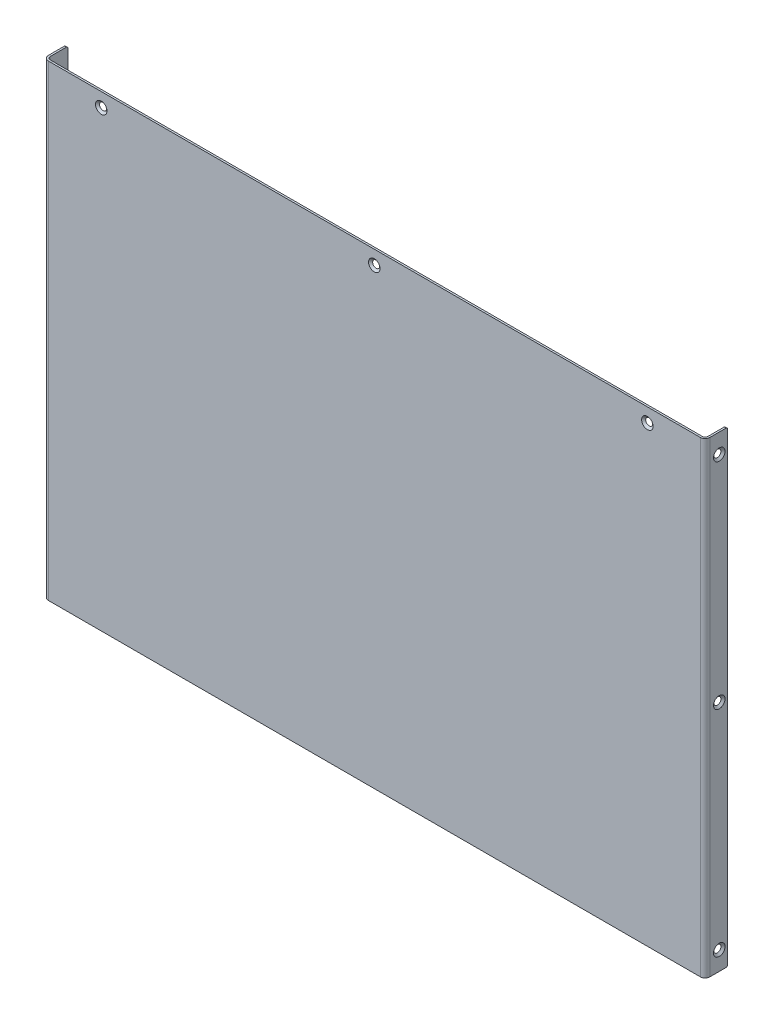
ISO-10303-21;
HEADER;
FILE_DESCRIPTION(('STEP AP214'),'2;1');
FILE_NAME('part.step','',(''),(''),'','','');
FILE_SCHEMA(('AUTOMOTIVE_DESIGN { 1 0 10303 214 1 1 1 1 }'));
ENDSEC;
DATA;
#1=APPLICATION_CONTEXT('core data for automotive mechanical design processes');
#2=APPLICATION_PROTOCOL_DEFINITION('international standard','automotive_design',2000,#1);
#3=PRODUCT_CONTEXT('',#1,'mechanical');
#4=PRODUCT('Part','Part','',(#3));
#5=PRODUCT_RELATED_PRODUCT_CATEGORY('part','',(#4));
#6=PRODUCT_DEFINITION_FORMATION('','',#4);
#7=PRODUCT_DEFINITION_CONTEXT('part definition',#1,'design');
#8=PRODUCT_DEFINITION('design','',#6,#7);
#9=PRODUCT_DEFINITION_SHAPE('','',#8);
#10=(LENGTH_UNIT() NAMED_UNIT(*) SI_UNIT(.MILLI.,.METRE.));
#11=(NAMED_UNIT(*) PLANE_ANGLE_UNIT() SI_UNIT($,.RADIAN.));
#12=(NAMED_UNIT(*) SI_UNIT($,.STERADIAN.) SOLID_ANGLE_UNIT());
#13=UNCERTAINTY_MEASURE_WITH_UNIT(LENGTH_MEASURE(1.E-05),#10,'distance_accuracy_value','');
#14=(GEOMETRIC_REPRESENTATION_CONTEXT(3) GLOBAL_UNCERTAINTY_ASSIGNED_CONTEXT((#13)) GLOBAL_UNIT_ASSIGNED_CONTEXT((#10,
#11,#12)) REPRESENTATION_CONTEXT('',''));
#15=CARTESIAN_POINT('',(0.,0.,0.));
#16=DIRECTION('',(0.,0.,1.));
#17=DIRECTION('',(1.,0.,0.));
#18=AXIS2_PLACEMENT_3D('',#15,#16,#17);
#19=CARTESIAN_POINT('',(-1.4732,152.654000000152,34.7834736718518));
#20=DIRECTION('',(1.,0.,0.));
#21=DIRECTION('',(0.,0.,-1.));
#22=AXIS2_PLACEMENT_3D('',#19,#20,#21);
#23=PLANE('',#22);
#24=CARTESIAN_POINT('',(-1.4732000000006,12.7,34.47415));
#25=DIRECTION('',(-1.,0.,0.));
#26=DIRECTION('',(0.,0.,1.));
#27=AXIS2_PLACEMENT_3D('',#24,#25,#26);
#28=CIRCLE('',#27,3.7464999999995);
#29=CARTESIAN_POINT('',(-1.4732000000006,12.7,38.2206499999995));
#30=VERTEX_POINT('',#29);
#31=EDGE_CURVE('E305',#30,#30,#28,.F.);
#32=ORIENTED_EDGE('',*,*,#31,.T.);
#33=EDGE_LOOP('',(#32));
#34=FACE_BOUND('',#33,.T.);
#35=CARTESIAN_POINT('',(-1.47320000000059,152.4,34.47415));
#36=DIRECTION('',(-1.,0.,0.));
#37=DIRECTION('',(0.,0.,1.));
#38=AXIS2_PLACEMENT_3D('',#35,#36,#37);
#39=CIRCLE('',#38,3.74649999999949);
#40=CARTESIAN_POINT('',(-1.47320000000059,152.4,38.2206499999995));
#41=VERTEX_POINT('',#40);
#42=EDGE_CURVE('E309',#41,#41,#39,.F.);
#43=ORIENTED_EDGE('',*,*,#42,.T.);
#44=EDGE_LOOP('',(#43));
#45=FACE_BOUND('',#44,.T.);
#46=CARTESIAN_POINT('',(-1.47320000000059,292.1,34.47415));
#47=DIRECTION('',(-1.,0.,0.));
#48=DIRECTION('',(0.,0.,1.));
#49=AXIS2_PLACEMENT_3D('',#46,#47,#48);
#50=CIRCLE('',#49,3.74649999999949);
#51=CARTESIAN_POINT('',(-1.47320000000059,292.1,38.2206499999995));
#52=VERTEX_POINT('',#51);
#53=EDGE_CURVE('E170',#52,#52,#50,.F.);
#54=ORIENTED_EDGE('',*,*,#53,.T.);
#55=EDGE_LOOP('',(#54));
#56=FACE_BOUND('',#55,.T.);
#57=CARTESIAN_POINT('',(-1.4732,303.53000000066,30.2513999993396));
#58=DIRECTION('',(-1.,0.,0.));
#59=DIRECTION('',(0.,0.,1.));
#60=AXIS2_PLACEMENT_3D('',#57,#58,#59);
#61=CIRCLE('',#60,1.2699999993523);
#62=CARTESIAN_POINT('',(-1.4732,303.53000000033,28.9813999999936));
#63=VERTEX_POINT('',#62);
#64=CARTESIAN_POINT('',(-1.4732,304.8,30.2513999996698));
#65=VERTEX_POINT('',#64);
#66=EDGE_CURVE('E142',#63,#65,#61,.F.);
#67=ORIENTED_EDGE('',*,*,#66,.F.);
#68=DIRECTION('',(0.,-1.,0.));
#69=VECTOR('',#68,1.);
#70=CARTESIAN_POINT('',(-1.4732,1.778,28.9814));
#71=LINE('',#70,#69);
#72=CARTESIAN_POINT('',(-1.4732,1.77799999967615,28.9814));
#73=VERTEX_POINT('',#72);
#74=EDGE_CURVE('E140',#63,#73,#71,.T.);
#75=ORIENTED_EDGE('',*,*,#74,.T.);
#76=CARTESIAN_POINT('',(-1.4732,1.7779999993523,30.251399999365));
#77=DIRECTION('',(-1.,0.,0.));
#78=DIRECTION('',(0.,0.,1.));
#79=AXIS2_PLACEMENT_3D('',#76,#77,#78);
#80=CIRCLE('',#79,1.2699999993523);
#81=CARTESIAN_POINT('',(-1.4732,0.507999999999998,30.2513999996825));
#82=VERTEX_POINT('',#81);
#83=EDGE_CURVE('E20',#82,#73,#80,.F.);
#84=ORIENTED_EDGE('',*,*,#83,.F.);
#85=DIRECTION('',(0.,0.,1.));
#86=VECTOR('',#85,1.);
#87=CARTESIAN_POINT('',(-1.4732,0.508,40.5638));
#88=LINE('',#87,#86);
#89=CARTESIAN_POINT('',(-1.47320000000001,0.508000000000004,40.5638000000001));
#90=VERTEX_POINT('',#89);
#91=EDGE_CURVE('E138',#82,#90,#88,.T.);
#92=ORIENTED_EDGE('',*,*,#91,.T.);
#93=DIRECTION('',(0.,-1.,0.));
#94=VECTOR('',#93,1.);
#95=CARTESIAN_POINT('',(-1.4732,304.8,40.5638));
#96=LINE('',#95,#94);
#97=CARTESIAN_POINT('',(-1.4732,304.8,40.5638));
#98=VERTEX_POINT('',#97);
#99=EDGE_CURVE('E178',#98,#90,#96,.T.);
#100=ORIENTED_EDGE('',*,*,#99,.F.);
#101=DIRECTION('',(0.,0.,-1.));
#102=VECTOR('',#101,1.);
#103=CARTESIAN_POINT('',(-1.4732,304.8,30.2514));
#104=LINE('',#103,#102);
#105=EDGE_CURVE('E167',#98,#65,#104,.T.);
#106=ORIENTED_EDGE('',*,*,#105,.T.);
#107=EDGE_LOOP('',(#67,#75,#84,#92,#100,#106));
#108=FACE_BOUND('',#107,.T.);
#109=ADVANCED_FACE('F17',(#34,#45,#56,#108),#23,.F.);
#110=CARTESIAN_POINT('',(429.4632,152.653999999848,34.7834736718518));
#111=DIRECTION('',(-1.,0.,0.));
#112=DIRECTION('',(0.,-1.,0.));
#113=AXIS2_PLACEMENT_3D('',#110,#111,#112);
#114=PLANE('',#113);
#115=CARTESIAN_POINT('',(429.463199999995,12.7,34.47415));
#116=DIRECTION('',(1.,0.,0.));
#117=DIRECTION('',(0.,0.,-1.));
#118=AXIS2_PLACEMENT_3D('',#115,#116,#117);
#119=CIRCLE('',#118,3.74650000000387);
#120=CARTESIAN_POINT('',(429.463199999995,12.7,30.7276499999961));
#121=VERTEX_POINT('',#120);
#122=EDGE_CURVE('E183',#121,#121,#119,.F.);
#123=ORIENTED_EDGE('',*,*,#122,.T.);
#124=EDGE_LOOP('',(#123));
#125=FACE_BOUND('',#124,.T.);
#126=CARTESIAN_POINT('',(429.463199999995,292.1,34.47415));
#127=DIRECTION('',(1.,0.,0.));
#128=DIRECTION('',(0.,0.,-1.));
#129=AXIS2_PLACEMENT_3D('',#126,#127,#128);
#130=CIRCLE('',#129,3.74650000000393);
#131=CARTESIAN_POINT('',(429.463199999995,292.1,30.7276499999961));
#132=VERTEX_POINT('',#131);
#133=EDGE_CURVE('E288',#132,#132,#130,.F.);
#134=ORIENTED_EDGE('',*,*,#133,.T.);
#135=EDGE_LOOP('',(#134));
#136=FACE_BOUND('',#135,.T.);
#137=CARTESIAN_POINT('',(429.463199999995,152.4,34.47415));
#138=DIRECTION('',(1.,0.,0.));
#139=DIRECTION('',(0.,0.,-1.));
#140=AXIS2_PLACEMENT_3D('',#137,#138,#139);
#141=CIRCLE('',#140,3.74650000000387);
#142=CARTESIAN_POINT('',(429.463199999995,152.4,30.7276499999961));
#143=VERTEX_POINT('',#142);
#144=EDGE_CURVE('E292',#143,#143,#141,.F.);
#145=ORIENTED_EDGE('',*,*,#144,.T.);
#146=EDGE_LOOP('',(#145));
#147=FACE_BOUND('',#146,.T.);
#148=CARTESIAN_POINT('',(429.4632,1.7779999993523,30.251399999365));
#149=DIRECTION('',(1.,0.,0.));
#150=DIRECTION('',(0.,1.,0.));
#151=AXIS2_PLACEMENT_3D('',#148,#149,#150);
#152=CIRCLE('',#151,1.2699999993523);
#153=CARTESIAN_POINT('',(429.4632,1.77799999967615,28.9814000000064));
#154=VERTEX_POINT('',#153);
#155=CARTESIAN_POINT('',(429.4632,0.508,30.2513999996825));
#156=VERTEX_POINT('',#155);
#157=EDGE_CURVE('E203',#154,#156,#152,.F.);
#158=ORIENTED_EDGE('',*,*,#157,.F.);
#159=DIRECTION('',(0.,-1.,0.));
#160=VECTOR('',#159,1.);
#161=CARTESIAN_POINT('',(429.4632,303.53,28.9814));
#162=LINE('',#161,#160);
#163=CARTESIAN_POINT('',(429.4632,303.53000000033,28.9814));
#164=VERTEX_POINT('',#163);
#165=EDGE_CURVE('E200',#154,#164,#162,.F.);
#166=ORIENTED_EDGE('',*,*,#165,.T.);
#167=CARTESIAN_POINT('',(429.4632,303.53000000066,30.2513999993396));
#168=DIRECTION('',(1.,0.,0.));
#169=DIRECTION('',(0.,1.,0.));
#170=AXIS2_PLACEMENT_3D('',#167,#168,#169);
#171=CIRCLE('',#170,1.2699999993523);
#172=CARTESIAN_POINT('',(429.4632,304.800000000006,30.2513999993396));
#173=VERTEX_POINT('',#172);
#174=EDGE_CURVE('E300',#173,#164,#171,.F.);
#175=ORIENTED_EDGE('',*,*,#174,.F.);
#176=DIRECTION('',(0.,0.,-1.));
#177=VECTOR('',#176,1.);
#178=CARTESIAN_POINT('',(429.4632,304.8,40.5638));
#179=LINE('',#178,#177);
#180=CARTESIAN_POINT('',(429.4632,304.8,40.5637999999999));
#181=VERTEX_POINT('',#180);
#182=EDGE_CURVE('E304',#173,#181,#179,.F.);
#183=ORIENTED_EDGE('',*,*,#182,.T.);
#184=DIRECTION('',(0.,1.,0.));
#185=VECTOR('',#184,1.);
#186=CARTESIAN_POINT('',(429.4632,0.507999999999999,40.5638));
#187=LINE('',#186,#185);
#188=CARTESIAN_POINT('',(429.4632,0.508000000000001,40.5638));
#189=VERTEX_POINT('',#188);
#190=EDGE_CURVE('E182',#189,#181,#187,.T.);
#191=ORIENTED_EDGE('',*,*,#190,.F.);
#192=DIRECTION('',(0.,0.,1.));
#193=VECTOR('',#192,1.);
#194=CARTESIAN_POINT('',(429.4632,0.508,30.2514));
#195=LINE('',#194,#193);
#196=EDGE_CURVE('E296',#189,#156,#195,.F.);
#197=ORIENTED_EDGE('',*,*,#196,.T.);
#198=EDGE_LOOP('',(#158,#166,#175,#183,#191,#197));
#199=FACE_BOUND('',#198,.T.);
#200=ADVANCED_FACE('F369',(#125,#136,#147,#199),#114,.F.);
#201=CARTESIAN_POINT('',(-1.4732,1.7779999993523,30.251399999365));
#202=DIRECTION('',(-1.,0.,0.));
#203=DIRECTION('',(0.,0.,1.));
#204=AXIS2_PLACEMENT_3D('',#201,#202,#203);
#205=CYLINDRICAL_SURFACE('',#204,1.2699999993523);
#206=CARTESIAN_POINT('',(-0.253999999999898,1.7779999993523,30.251399999365));
#207=DIRECTION('',(-1.,0.,0.));
#208=DIRECTION('',(0.,0.,1.));
#209=AXIS2_PLACEMENT_3D('',#206,#207,#208);
#210=CIRCLE('',#209,1.2699999993523);
#211=CARTESIAN_POINT('',(-0.253999999999903,0.508000000000006,30.2513999996825));
#212=VERTEX_POINT('',#211);
#213=CARTESIAN_POINT('',(-0.253999999999904,1.77799999967615,28.9814));
#214=VERTEX_POINT('',#213);
#215=EDGE_CURVE('E273',#212,#214,#210,.F.);
#216=ORIENTED_EDGE('',*,*,#215,.F.);
#217=DIRECTION('',(-1.,0.,0.));
#218=VECTOR('',#217,1.);
#219=CARTESIAN_POINT('',(-1.4732,0.508,30.2514));
#220=LINE('',#219,#218);
#221=EDGE_CURVE('E136',#212,#82,#220,.T.);
#222=ORIENTED_EDGE('',*,*,#221,.T.);
#223=ORIENTED_EDGE('',*,*,#83,.T.);
#224=DIRECTION('',(1.,0.,0.));
#225=VECTOR('',#224,1.);
#226=CARTESIAN_POINT('',(-1.4732,1.778,28.9814));
#227=LINE('',#226,#225);
#228=EDGE_CURVE('E134',#73,#214,#227,.T.);
#229=ORIENTED_EDGE('',*,*,#228,.T.);
#230=EDGE_LOOP('',(#216,#222,#223,#229));
#231=FACE_BOUND('',#230,.T.);
#232=ADVANCED_FACE('F132',(#231),#205,.T.);
#233=CARTESIAN_POINT('',(-1.4732,1.778,28.9814));
#234=DIRECTION('',(0.,0.,1.));
#235=DIRECTION('',(0.,-1.,0.));
#236=AXIS2_PLACEMENT_3D('',#233,#234,#235);
#237=PLANE('',#236);
#238=DIRECTION('',(-1.,0.,0.));
#239=VECTOR('',#238,1.);
#240=CARTESIAN_POINT('',(-1.4732,303.53,28.9813999999873));
#241=LINE('',#240,#239);
#242=CARTESIAN_POINT('',(-0.253999999999873,303.53000000033,28.9813999999936));
#243=VERTEX_POINT('',#242);
#244=EDGE_CURVE('E157',#243,#63,#241,.T.);
#245=ORIENTED_EDGE('',*,*,#244,.F.);
#246=DIRECTION('',(0.,1.,0.));
#247=VECTOR('',#246,1.);
#248=CARTESIAN_POINT('',(-0.253999999999899,152.654000000152,28.9814));
#249=LINE('',#248,#247);
#250=EDGE_CURVE('E149',#214,#243,#249,.T.);
#251=ORIENTED_EDGE('',*,*,#250,.F.);
#252=ORIENTED_EDGE('',*,*,#228,.F.);
#253=ORIENTED_EDGE('',*,*,#74,.F.);
#254=EDGE_LOOP('',(#245,#251,#252,#253));
#255=FACE_BOUND('',#254,.T.);
#256=ADVANCED_FACE('F147',(#255),#237,.F.);
#257=CARTESIAN_POINT('',(-1.4732,303.53000000066,30.2513999993396));
#258=DIRECTION('',(-1.,0.,0.));
#259=DIRECTION('',(0.,0.,1.));
#260=AXIS2_PLACEMENT_3D('',#257,#258,#259);
#261=CYLINDRICAL_SURFACE('',#260,1.2699999993523);
#262=CARTESIAN_POINT('',(-0.253999999999873,303.53000000066,30.2513999993396));
#263=DIRECTION('',(-1.,0.,0.));
#264=DIRECTION('',(0.,0.,1.));
#265=AXIS2_PLACEMENT_3D('',#262,#263,#264);
#266=CIRCLE('',#265,1.2699999993523);
#267=CARTESIAN_POINT('',(-0.253999999999881,304.8,30.2513999996698));
#268=VERTEX_POINT('',#267);
#269=EDGE_CURVE('E269',#243,#268,#266,.F.);
#270=ORIENTED_EDGE('',*,*,#269,.F.);
#271=ORIENTED_EDGE('',*,*,#244,.T.);
#272=ORIENTED_EDGE('',*,*,#66,.T.);
#273=DIRECTION('',(1.,0.,0.));
#274=VECTOR('',#273,1.);
#275=CARTESIAN_POINT('',(-1.4732,304.8,30.2514));
#276=LINE('',#275,#274);
#277=EDGE_CURVE('E171',#65,#268,#276,.T.);
#278=ORIENTED_EDGE('',*,*,#277,.T.);
#279=EDGE_LOOP('',(#270,#271,#272,#278));
#280=FACE_BOUND('',#279,.T.);
#281=ADVANCED_FACE('F644',(#280),#261,.T.);
#282=CARTESIAN_POINT('',(-1.47320000000059,292.1,34.47415));
#283=DIRECTION('',(-1.,0.,0.));
#284=DIRECTION('',(0.,0.,1.));
#285=AXIS2_PLACEMENT_3D('',#282,#283,#284);
#286=CONICAL_SURFACE('',#285,3.74649999999949,0.872664625996998);
#287=CARTESIAN_POINT('',(-0.253999999994314,292.1,34.47415));
#288=DIRECTION('',(-1.,0.,0.));
#289=DIRECTION('',(0.,0.,1.));
#290=AXIS2_PLACEMENT_3D('',#287,#288,#289);
#291=CIRCLE('',#290,2.29351401990163);
#292=CARTESIAN_POINT('',(-0.253999999994314,292.1,36.7676640199016));
#293=VERTEX_POINT('',#292);
#294=EDGE_CURVE('E264',#293,#293,#291,.T.);
#295=ORIENTED_EDGE('',*,*,#294,.F.);
#296=EDGE_LOOP('',(#295));
#297=FACE_BOUND('',#296,.T.);
#298=ORIENTED_EDGE('',*,*,#53,.F.);
#299=EDGE_LOOP('',(#298));
#300=FACE_BOUND('',#299,.T.);
#301=ADVANCED_FACE('F635',(#297,#300),#286,.F.);
#302=CARTESIAN_POINT('',(-1.47320000000059,152.4,34.47415));
#303=DIRECTION('',(-1.,0.,0.));
#304=DIRECTION('',(0.,0.,1.));
#305=AXIS2_PLACEMENT_3D('',#302,#303,#304);
#306=CONICAL_SURFACE('',#305,3.74649999999949,0.872664625997001);
#307=CARTESIAN_POINT('',(-0.253999999994314,152.4,34.47415));
#308=DIRECTION('',(-1.,0.,0.));
#309=DIRECTION('',(0.,0.,1.));
#310=AXIS2_PLACEMENT_3D('',#307,#308,#309);
#311=CIRCLE('',#310,2.29351401990163);
#312=CARTESIAN_POINT('',(-0.253999999994314,152.4,36.7676640199016));
#313=VERTEX_POINT('',#312);
#314=EDGE_CURVE('E260',#313,#313,#311,.T.);
#315=ORIENTED_EDGE('',*,*,#314,.F.);
#316=EDGE_LOOP('',(#315));
#317=FACE_BOUND('',#316,.T.);
#318=ORIENTED_EDGE('',*,*,#42,.F.);
#319=EDGE_LOOP('',(#318));
#320=FACE_BOUND('',#319,.T.);
#321=ADVANCED_FACE('F626',(#317,#320),#306,.F.);
#322=CARTESIAN_POINT('',(-1.4732000000006,12.7,34.47415));
#323=DIRECTION('',(-1.,0.,0.));
#324=DIRECTION('',(0.,0.,1.));
#325=AXIS2_PLACEMENT_3D('',#322,#323,#324);
#326=CONICAL_SURFACE('',#325,3.7464999999995,0.872664625997);
#327=CARTESIAN_POINT('',(-0.25399999999435,12.7,34.47415));
#328=DIRECTION('',(-1.,0.,0.));
#329=DIRECTION('',(0.,0.,1.));
#330=AXIS2_PLACEMENT_3D('',#327,#328,#329);
#331=CIRCLE('',#330,2.29351401990167);
#332=CARTESIAN_POINT('',(-0.253999999994349,12.7,36.7676640199017));
#333=VERTEX_POINT('',#332);
#334=EDGE_CURVE('E256',#333,#333,#331,.T.);
#335=ORIENTED_EDGE('',*,*,#334,.F.);
#336=EDGE_LOOP('',(#335));
#337=FACE_BOUND('',#336,.T.);
#338=ORIENTED_EDGE('',*,*,#31,.F.);
#339=EDGE_LOOP('',(#338));
#340=FACE_BOUND('',#339,.T.);
#341=ADVANCED_FACE('F618',(#337,#340),#326,.F.);
#342=CARTESIAN_POINT('',(429.4632,303.53000000066,30.2513999993396));
#343=DIRECTION('',(1.,0.,0.));
#344=DIRECTION('',(0.,1.,0.));
#345=AXIS2_PLACEMENT_3D('',#342,#343,#344);
#346=CYLINDRICAL_SURFACE('',#345,1.2699999993523);
#347=CARTESIAN_POINT('',(428.244,303.53000000066,30.2513999993396));
#348=DIRECTION('',(1.,0.,0.));
#349=DIRECTION('',(0.,1.,0.));
#350=AXIS2_PLACEMENT_3D('',#347,#348,#349);
#351=CIRCLE('',#350,1.2699999993523);
#352=CARTESIAN_POINT('',(428.244,304.800000000006,30.2513999993396));
#353=VERTEX_POINT('',#352);
#354=CARTESIAN_POINT('',(428.244,303.53000000033,28.9814));
#355=VERTEX_POINT('',#354);
#356=EDGE_CURVE('E243',#353,#355,#351,.F.);
#357=ORIENTED_EDGE('',*,*,#356,.F.);
#358=DIRECTION('',(1.,0.,0.));
#359=VECTOR('',#358,1.);
#360=CARTESIAN_POINT('',(429.4632,304.800000000013,30.2513999993396));
#361=LINE('',#360,#359);
#362=EDGE_CURVE('E303',#353,#173,#361,.T.);
#363=ORIENTED_EDGE('',*,*,#362,.T.);
#364=ORIENTED_EDGE('',*,*,#174,.T.);
#365=DIRECTION('',(1.,0.,0.));
#366=VECTOR('',#365,1.);
#367=CARTESIAN_POINT('',(429.4632,303.53,28.9814));
#368=LINE('',#367,#366);
#369=EDGE_CURVE('E204',#164,#355,#368,.F.);
#370=ORIENTED_EDGE('',*,*,#369,.T.);
#371=EDGE_LOOP('',(#357,#363,#364,#370));
#372=FACE_BOUND('',#371,.T.);
#373=ADVANCED_FACE('F407',(#372),#346,.T.);
#374=CARTESIAN_POINT('',(429.4632,303.53,28.9814));
#375=DIRECTION('',(0.,0.,1.));
#376=DIRECTION('',(0.,-1.,0.));
#377=AXIS2_PLACEMENT_3D('',#374,#375,#376);
#378=PLANE('',#377);
#379=DIRECTION('',(1.,0.,0.));
#380=VECTOR('',#379,1.);
#381=CARTESIAN_POINT('',(429.4632,1.778,28.9814000000127));
#382=LINE('',#381,#380);
#383=CARTESIAN_POINT('',(428.244,1.77799999967615,28.9814000000063));
#384=VERTEX_POINT('',#383);
#385=EDGE_CURVE('E299',#384,#154,#382,.T.);
#386=ORIENTED_EDGE('',*,*,#385,.F.);
#387=DIRECTION('',(0.,-1.,0.));
#388=VECTOR('',#387,1.);
#389=CARTESIAN_POINT('',(428.244,152.653999999848,28.9814));
#390=LINE('',#389,#388);
#391=EDGE_CURVE('E242',#355,#384,#390,.T.);
#392=ORIENTED_EDGE('',*,*,#391,.F.);
#393=ORIENTED_EDGE('',*,*,#369,.F.);
#394=ORIENTED_EDGE('',*,*,#165,.F.);
#395=EDGE_LOOP('',(#386,#392,#393,#394));
#396=FACE_BOUND('',#395,.T.);
#397=ADVANCED_FACE('F391',(#396),#378,.F.);
#398=CARTESIAN_POINT('',(429.4632,1.7779999993523,30.251399999365));
#399=DIRECTION('',(1.,0.,0.));
#400=DIRECTION('',(0.,1.,0.));
#401=AXIS2_PLACEMENT_3D('',#398,#399,#400);
#402=CYLINDRICAL_SURFACE('',#401,1.2699999993523);
#403=CARTESIAN_POINT('',(428.244,1.7779999993523,30.251399999365));
#404=DIRECTION('',(1.,0.,0.));
#405=DIRECTION('',(0.,1.,0.));
#406=AXIS2_PLACEMENT_3D('',#403,#404,#405);
#407=CIRCLE('',#406,1.2699999993523);
#408=CARTESIAN_POINT('',(428.244,0.508000000000006,30.2513999996825));
#409=VERTEX_POINT('',#408);
#410=EDGE_CURVE('E238',#384,#409,#407,.F.);
#411=ORIENTED_EDGE('',*,*,#410,.F.);
#412=ORIENTED_EDGE('',*,*,#385,.T.);
#413=ORIENTED_EDGE('',*,*,#157,.T.);
#414=DIRECTION('',(1.,0.,0.));
#415=VECTOR('',#414,1.);
#416=CARTESIAN_POINT('',(429.4632,0.508,30.2514));
#417=LINE('',#416,#415);
#418=EDGE_CURVE('E358',#156,#409,#417,.F.);
#419=ORIENTED_EDGE('',*,*,#418,.T.);
#420=EDGE_LOOP('',(#411,#412,#413,#419));
#421=FACE_BOUND('',#420,.T.);
#422=ADVANCED_FACE('F394',(#421),#402,.T.);
#423=CARTESIAN_POINT('',(429.463199999995,152.4,34.47415));
#424=DIRECTION('',(1.,0.,0.));
#425=DIRECTION('',(0.,0.,-1.));
#426=AXIS2_PLACEMENT_3D('',#423,#424,#425);
#427=CONICAL_SURFACE('',#426,3.74650000000387,0.872664625997002);
#428=CARTESIAN_POINT('',(428.243999999989,152.4,34.47415));
#429=DIRECTION('',(1.,0.,0.));
#430=DIRECTION('',(0.,0.,-1.));
#431=AXIS2_PLACEMENT_3D('',#428,#429,#430);
#432=CIRCLE('',#431,2.29351401990605);
#433=CARTESIAN_POINT('',(428.243999999989,152.4,32.180635980094));
#434=VERTEX_POINT('',#433);
#435=EDGE_CURVE('E233',#434,#434,#432,.T.);
#436=ORIENTED_EDGE('',*,*,#435,.F.);
#437=EDGE_LOOP('',(#436));
#438=FACE_BOUND('',#437,.T.);
#439=ORIENTED_EDGE('',*,*,#144,.F.);
#440=EDGE_LOOP('',(#439));
#441=FACE_BOUND('',#440,.T.);
#442=ADVANCED_FACE('F587',(#438,#441),#427,.F.);
#443=CARTESIAN_POINT('',(429.463199999995,292.1,34.47415));
#444=DIRECTION('',(1.,0.,0.));
#445=DIRECTION('',(0.,0.,-1.));
#446=AXIS2_PLACEMENT_3D('',#443,#444,#445);
#447=CONICAL_SURFACE('',#446,3.74650000000393,0.872664625996996);
#448=CARTESIAN_POINT('',(428.243999999989,292.1,34.47415));
#449=DIRECTION('',(1.,0.,0.));
#450=DIRECTION('',(0.,0.,-1.));
#451=AXIS2_PLACEMENT_3D('',#448,#449,#450);
#452=CIRCLE('',#451,2.29351401990618);
#453=CARTESIAN_POINT('',(428.243999999989,292.1,32.1806359800938));
#454=VERTEX_POINT('',#453);
#455=EDGE_CURVE('E229',#454,#454,#452,.T.);
#456=ORIENTED_EDGE('',*,*,#455,.F.);
#457=EDGE_LOOP('',(#456));
#458=FACE_BOUND('',#457,.T.);
#459=ORIENTED_EDGE('',*,*,#133,.F.);
#460=EDGE_LOOP('',(#459));
#461=FACE_BOUND('',#460,.T.);
#462=ADVANCED_FACE('F578',(#458,#461),#447,.F.);
#463=CARTESIAN_POINT('',(429.463199999995,12.7,34.47415));
#464=DIRECTION('',(1.,0.,0.));
#465=DIRECTION('',(0.,0.,-1.));
#466=AXIS2_PLACEMENT_3D('',#463,#464,#465);
#467=CONICAL_SURFACE('',#466,3.74650000000387,0.872664625996999);
#468=CARTESIAN_POINT('',(428.243999999989,12.7,34.47415));
#469=DIRECTION('',(1.,0.,0.));
#470=DIRECTION('',(0.,0.,-1.));
#471=AXIS2_PLACEMENT_3D('',#468,#469,#470);
#472=CIRCLE('',#471,2.29351401990605);
#473=CARTESIAN_POINT('',(428.243999999989,12.7,32.1806359800939));
#474=VERTEX_POINT('',#473);
#475=EDGE_CURVE('E177',#474,#474,#472,.T.);
#476=ORIENTED_EDGE('',*,*,#475,.F.);
#477=EDGE_LOOP('',(#476));
#478=FACE_BOUND('',#477,.T.);
#479=ORIENTED_EDGE('',*,*,#122,.F.);
#480=EDGE_LOOP('',(#479));
#481=FACE_BOUND('',#480,.T.);
#482=ADVANCED_FACE('F570',(#478,#481),#467,.F.);
#483=CARTESIAN_POINT('',(1.651,304.8,40.5638));
#484=DIRECTION('',(0.,-1.,0.));
#485=DIRECTION('',(0.,0.,-1.));
#486=AXIS2_PLACEMENT_3D('',#483,#484,#485);
#487=CYLINDRICAL_SURFACE('',#486,3.1242);
#488=CARTESIAN_POINT('',(1.651,304.8,40.5638));
#489=DIRECTION('',(0.,-1.,0.));
#490=DIRECTION('',(0.,0.,-1.));
#491=AXIS2_PLACEMENT_3D('',#488,#489,#490);
#492=CIRCLE('',#491,3.1242);
#493=CARTESIAN_POINT('',(1.65100000000001,304.8,43.688));
#494=VERTEX_POINT('',#493);
#495=EDGE_CURVE('E277',#494,#98,#492,.T.);
#496=ORIENTED_EDGE('',*,*,#495,.T.);
#497=ORIENTED_EDGE('',*,*,#99,.T.);
#498=CARTESIAN_POINT('',(1.65099999999998,0.508000000000008,40.5638000000001));
#499=DIRECTION('',(0.,-1.,0.));
#500=DIRECTION('',(0.,0.,-1.));
#501=AXIS2_PLACEMENT_3D('',#498,#499,#500);
#502=CIRCLE('',#501,3.1242);
#503=CARTESIAN_POINT('',(1.651,0.508000000000054,43.688));
#504=VERTEX_POINT('',#503);
#505=EDGE_CURVE('E281',#504,#90,#502,.T.);
#506=ORIENTED_EDGE('',*,*,#505,.F.);
#507=DIRECTION('',(0.,1.,0.));
#508=VECTOR('',#507,1.);
#509=CARTESIAN_POINT('',(1.65100000000001,152.654,43.688));
#510=LINE('',#509,#508);
#511=EDGE_CURVE('E172',#504,#494,#510,.T.);
#512=ORIENTED_EDGE('',*,*,#511,.T.);
#513=EDGE_LOOP('',(#496,#497,#506,#512));
#514=FACE_BOUND('',#513,.T.);
#515=ADVANCED_FACE('F379',(#514),#487,.T.);
#516=CARTESIAN_POINT('',(426.339,0.508,40.5638));
#517=DIRECTION('',(0.,1.,0.));
#518=DIRECTION('',(0.,0.,1.));
#519=AXIS2_PLACEMENT_3D('',#516,#517,#518);
#520=CYLINDRICAL_SURFACE('',#519,3.1242);
#521=CARTESIAN_POINT('',(426.339,0.507999999999999,40.5638));
#522=DIRECTION('',(0.,1.,0.));
#523=DIRECTION('',(0.,0.,1.));
#524=AXIS2_PLACEMENT_3D('',#521,#522,#523);
#525=CIRCLE('',#524,3.1242);
#526=CARTESIAN_POINT('',(426.339,0.508000000000002,43.688));
#527=VERTEX_POINT('',#526);
#528=EDGE_CURVE('E248',#527,#189,#525,.T.);
#529=ORIENTED_EDGE('',*,*,#528,.T.);
#530=ORIENTED_EDGE('',*,*,#190,.T.);
#531=CARTESIAN_POINT('',(426.339,304.8,40.5637999999999));
#532=DIRECTION('',(0.,1.,0.));
#533=DIRECTION('',(0.,0.,1.));
#534=AXIS2_PLACEMENT_3D('',#531,#532,#533);
#535=CIRCLE('',#534,3.1242);
#536=CARTESIAN_POINT('',(426.339,304.8,43.6879999999999));
#537=VERTEX_POINT('',#536);
#538=EDGE_CURVE('E252',#537,#181,#535,.T.);
#539=ORIENTED_EDGE('',*,*,#538,.F.);
#540=DIRECTION('',(0.,1.,0.));
#541=VECTOR('',#540,1.);
#542=CARTESIAN_POINT('',(426.339,152.654,43.688));
#543=LINE('',#542,#541);
#544=EDGE_CURVE('E176',#537,#527,#543,.F.);
#545=ORIENTED_EDGE('',*,*,#544,.T.);
#546=EDGE_LOOP('',(#529,#530,#539,#545));
#547=FACE_BOUND('',#546,.T.);
#548=ADVANCED_FACE('F372',(#547),#520,.T.);
#549=CARTESIAN_POINT('',(-0.253999999999898,152.654000000152,34.7834736718518));
#550=DIRECTION('',(1.,0.,0.));
#551=DIRECTION('',(0.,0.,-1.));
#552=AXIS2_PLACEMENT_3D('',#549,#550,#551);
#553=PLANE('',#552);
#554=ORIENTED_EDGE('',*,*,#334,.T.);
#555=EDGE_LOOP('',(#554));
#556=FACE_BOUND('',#555,.T.);
#557=ORIENTED_EDGE('',*,*,#314,.T.);
#558=EDGE_LOOP('',(#557));
#559=FACE_BOUND('',#558,.T.);
#560=ORIENTED_EDGE('',*,*,#294,.T.);
#561=EDGE_LOOP('',(#560));
#562=FACE_BOUND('',#561,.T.);
#563=ORIENTED_EDGE('',*,*,#269,.T.);
#564=DIRECTION('',(0.,0.,-1.));
#565=VECTOR('',#564,1.);
#566=CARTESIAN_POINT('',(-0.253999999999889,304.8,34.7834736718518));
#567=LINE('',#566,#565);
#568=CARTESIAN_POINT('',(-0.253999999999944,304.8,40.5638));
#569=VERTEX_POINT('',#568);
#570=EDGE_CURVE('E268',#268,#569,#567,.F.);
#571=ORIENTED_EDGE('',*,*,#570,.T.);
#572=DIRECTION('',(0.,-1.,0.));
#573=VECTOR('',#572,1.);
#574=CARTESIAN_POINT('',(-0.254,304.8,40.5638));
#575=LINE('',#574,#573);
#576=CARTESIAN_POINT('',(-0.253999999999977,0.508000000000006,40.5638));
#577=VERTEX_POINT('',#576);
#578=EDGE_CURVE('E329',#569,#577,#575,.T.);
#579=ORIENTED_EDGE('',*,*,#578,.T.);
#580=DIRECTION('',(0.,0.,-1.));
#581=VECTOR('',#580,1.);
#582=CARTESIAN_POINT('',(-0.253999999999908,0.508000000000008,34.7834736718518));
#583=LINE('',#582,#581);
#584=EDGE_CURVE('E276',#577,#212,#583,.T.);
#585=ORIENTED_EDGE('',*,*,#584,.T.);
#586=ORIENTED_EDGE('',*,*,#215,.T.);
#587=ORIENTED_EDGE('',*,*,#250,.T.);
#588=EDGE_LOOP('',(#563,#571,#579,#585,#586,#587));
#589=FACE_BOUND('',#588,.T.);
#590=ADVANCED_FACE('F428',(#556,#559,#562,#589),#553,.T.);
#591=CARTESIAN_POINT('',(428.244,152.653999999848,34.7834736718518));
#592=DIRECTION('',(-1.,0.,0.));
#593=DIRECTION('',(0.,-1.,0.));
#594=AXIS2_PLACEMENT_3D('',#591,#592,#593);
#595=PLANE('',#594);
#596=ORIENTED_EDGE('',*,*,#475,.T.);
#597=EDGE_LOOP('',(#596));
#598=FACE_BOUND('',#597,.T.);
#599=ORIENTED_EDGE('',*,*,#455,.T.);
#600=EDGE_LOOP('',(#599));
#601=FACE_BOUND('',#600,.T.);
#602=ORIENTED_EDGE('',*,*,#435,.T.);
#603=EDGE_LOOP('',(#602));
#604=FACE_BOUND('',#603,.T.);
#605=ORIENTED_EDGE('',*,*,#410,.T.);
#606=DIRECTION('',(0.,0.,1.));
#607=VECTOR('',#606,1.);
#608=CARTESIAN_POINT('',(428.244,0.508000000000008,34.7834736718518));
#609=LINE('',#608,#607);
#610=CARTESIAN_POINT('',(428.244,0.508000000000004,40.5638));
#611=VERTEX_POINT('',#610);
#612=EDGE_CURVE('E237',#409,#611,#609,.T.);
#613=ORIENTED_EDGE('',*,*,#612,.T.);
#614=DIRECTION('',(0.,1.,0.));
#615=VECTOR('',#614,1.);
#616=CARTESIAN_POINT('',(428.244,0.508,40.5638));
#617=LINE('',#616,#615);
#618=CARTESIAN_POINT('',(428.244,304.8,40.5638));
#619=VERTEX_POINT('',#618);
#620=EDGE_CURVE('E225',#611,#619,#617,.T.);
#621=ORIENTED_EDGE('',*,*,#620,.T.);
#622=DIRECTION('',(0.,0.,1.));
#623=VECTOR('',#622,1.);
#624=CARTESIAN_POINT('',(428.244,304.8,34.7834736718518));
#625=LINE('',#624,#623);
#626=EDGE_CURVE('E247',#619,#353,#625,.F.);
#627=ORIENTED_EDGE('',*,*,#626,.T.);
#628=ORIENTED_EDGE('',*,*,#356,.T.);
#629=ORIENTED_EDGE('',*,*,#391,.T.);
#630=EDGE_LOOP('',(#605,#613,#621,#627,#628,#629));
#631=FACE_BOUND('',#630,.T.);
#632=ADVANCED_FACE('F415',(#598,#601,#604,#631),#595,.T.);
#633=CARTESIAN_POINT('',(213.995,152.654,43.688));
#634=DIRECTION('',(0.,0.,-1.));
#635=DIRECTION('',(0.,1.,0.));
#636=AXIS2_PLACEMENT_3D('',#633,#634,#635);
#637=PLANE('',#636);
#638=CARTESIAN_POINT('',(213.995,295.68775,43.6879999999954));
#639=DIRECTION('',(0.,0.,1.));
#640=DIRECTION('',(1.,0.,0.));
#641=AXIS2_PLACEMENT_3D('',#638,#639,#640);
#642=CIRCLE('',#641,3.7465000000039);
#643=CARTESIAN_POINT('',(217.741500000004,295.68775,43.6879999999954));
#644=VERTEX_POINT('',#643);
#645=EDGE_CURVE('E213',#644,#644,#642,.F.);
#646=ORIENTED_EDGE('',*,*,#645,.T.);
#647=EDGE_LOOP('',(#646));
#648=FACE_BOUND('',#647,.T.);
#649=CARTESIAN_POINT('',(391.8458,295.68775,43.6879999999954));
#650=DIRECTION('',(0.,0.,1.));
#651=DIRECTION('',(1.,0.,0.));
#652=AXIS2_PLACEMENT_3D('',#649,#650,#651);
#653=CIRCLE('',#652,3.74650000000387);
#654=CARTESIAN_POINT('',(395.592300000004,295.68775,43.6879999999954));
#655=VERTEX_POINT('',#654);
#656=EDGE_CURVE('E217',#655,#655,#653,.F.);
#657=ORIENTED_EDGE('',*,*,#656,.T.);
#658=EDGE_LOOP('',(#657));
#659=FACE_BOUND('',#658,.T.);
#660=CARTESIAN_POINT('',(36.1442,295.68775,43.6879999999954));
#661=DIRECTION('',(0.,0.,1.));
#662=DIRECTION('',(1.,0.,0.));
#663=AXIS2_PLACEMENT_3D('',#660,#661,#662);
#664=CIRCLE('',#663,3.74650000000388);
#665=CARTESIAN_POINT('',(39.8907000000039,295.68775,43.6879999999954));
#666=VERTEX_POINT('',#665);
#667=EDGE_CURVE('E221',#666,#666,#664,.F.);
#668=ORIENTED_EDGE('',*,*,#667,.T.);
#669=EDGE_LOOP('',(#668));
#670=FACE_BOUND('',#669,.T.);
#671=DIRECTION('',(1.,0.,0.));
#672=VECTOR('',#671,1.);
#673=CARTESIAN_POINT('',(1.651,304.8,43.688));
#674=LINE('',#673,#672);
#675=EDGE_CURVE('E325',#537,#494,#674,.F.);
#676=ORIENTED_EDGE('',*,*,#675,.T.);
#677=ORIENTED_EDGE('',*,*,#511,.F.);
#678=DIRECTION('',(1.,0.,0.));
#679=VECTOR('',#678,1.);
#680=CARTESIAN_POINT('',(426.339,0.508,43.688));
#681=LINE('',#680,#679);
#682=EDGE_CURVE('E164',#504,#527,#681,.T.);
#683=ORIENTED_EDGE('',*,*,#682,.T.);
#684=ORIENTED_EDGE('',*,*,#544,.F.);
#685=EDGE_LOOP('',(#676,#677,#683,#684));
#686=FACE_BOUND('',#685,.T.);
#687=ADVANCED_FACE('F381',(#648,#659,#670,#686),#637,.F.);
#688=CARTESIAN_POINT('',(426.339,0.508,43.688));
#689=DIRECTION('',(0.,1.,0.));
#690=DIRECTION('',(0.,0.,1.));
#691=AXIS2_PLACEMENT_3D('',#688,#689,#690);
#692=PLANE('',#691);
#693=ORIENTED_EDGE('',*,*,#682,.F.);
#694=ORIENTED_EDGE('',*,*,#505,.T.);
#695=ORIENTED_EDGE('',*,*,#91,.F.);
#696=ORIENTED_EDGE('',*,*,#221,.F.);
#697=ORIENTED_EDGE('',*,*,#584,.F.);
#698=CARTESIAN_POINT('',(1.65099999999998,0.508000000000008,40.5638000000001));
#699=DIRECTION('',(0.,-1.,0.));
#700=DIRECTION('',(0.,0.,-1.));
#701=AXIS2_PLACEMENT_3D('',#698,#699,#700);
#702=CIRCLE('',#701,1.905);
#703=CARTESIAN_POINT('',(1.651,0.508000000000028,42.4688));
#704=VERTEX_POINT('',#703);
#705=EDGE_CURVE('E160',#577,#704,#702,.F.);
#706=ORIENTED_EDGE('',*,*,#705,.T.);
#707=DIRECTION('',(1.,0.,0.));
#708=VECTOR('',#707,1.);
#709=CARTESIAN_POINT('',(213.995,0.508000000000008,42.4688000000001));
#710=LINE('',#709,#708);
#711=CARTESIAN_POINT('',(426.339,0.508000000000001,42.4688));
#712=VERTEX_POINT('',#711);
#713=EDGE_CURVE('E195',#712,#704,#710,.F.);
#714=ORIENTED_EDGE('',*,*,#713,.F.);
#715=CARTESIAN_POINT('',(426.339,0.507999999999999,40.5638));
#716=DIRECTION('',(0.,1.,0.));
#717=DIRECTION('',(0.,0.,1.));
#718=AXIS2_PLACEMENT_3D('',#715,#716,#717);
#719=CIRCLE('',#718,1.905);
#720=EDGE_CURVE('E346',#712,#611,#719,.T.);
#721=ORIENTED_EDGE('',*,*,#720,.T.);
#722=ORIENTED_EDGE('',*,*,#612,.F.);
#723=ORIENTED_EDGE('',*,*,#418,.F.);
#724=ORIENTED_EDGE('',*,*,#196,.F.);
#725=ORIENTED_EDGE('',*,*,#528,.F.);
#726=EDGE_LOOP('',(#693,#694,#695,#696,#697,#706,#714,#721,#722,#723,#724,#725));
#727=FACE_BOUND('',#726,.T.);
#728=ADVANCED_FACE('F383',(#727),#692,.F.);
#729=CARTESIAN_POINT('',(1.651,304.8,40.5638));
#730=DIRECTION('',(0.,-1.,0.));
#731=DIRECTION('',(0.,0.,-1.));
#732=AXIS2_PLACEMENT_3D('',#729,#730,#731);
#733=CYLINDRICAL_SURFACE('',#732,1.905);
#734=CARTESIAN_POINT('',(1.651,304.8,40.5638));
#735=DIRECTION('',(0.,-1.,0.));
#736=DIRECTION('',(0.,0.,-1.));
#737=AXIS2_PLACEMENT_3D('',#734,#735,#736);
#738=CIRCLE('',#737,1.905);
#739=CARTESIAN_POINT('',(1.651,304.8,42.4688));
#740=VERTEX_POINT('',#739);
#741=EDGE_CURVE('E163',#740,#569,#738,.T.);
#742=ORIENTED_EDGE('',*,*,#741,.F.);
#743=DIRECTION('',(0.,1.,0.));
#744=VECTOR('',#743,1.);
#745=CARTESIAN_POINT('',(1.65100000000001,152.654,42.4688));
#746=LINE('',#745,#744);
#747=EDGE_CURVE('E189',#704,#740,#746,.T.);
#748=ORIENTED_EDGE('',*,*,#747,.F.);
#749=ORIENTED_EDGE('',*,*,#705,.F.);
#750=ORIENTED_EDGE('',*,*,#578,.F.);
#751=EDGE_LOOP('',(#742,#748,#749,#750));
#752=FACE_BOUND('',#751,.T.);
#753=ADVANCED_FACE('F431',(#752),#733,.F.);
#754=CARTESIAN_POINT('',(1.651,304.8,43.688));
#755=DIRECTION('',(0.,-1.,0.));
#756=DIRECTION('',(0.,0.,-1.));
#757=AXIS2_PLACEMENT_3D('',#754,#755,#756);
#758=PLANE('',#757);
#759=ORIENTED_EDGE('',*,*,#675,.F.);
#760=ORIENTED_EDGE('',*,*,#538,.T.);
#761=ORIENTED_EDGE('',*,*,#182,.F.);
#762=ORIENTED_EDGE('',*,*,#362,.F.);
#763=ORIENTED_EDGE('',*,*,#626,.F.);
#764=CARTESIAN_POINT('',(426.339,304.8,40.5637999999999));
#765=DIRECTION('',(0.,1.,0.));
#766=DIRECTION('',(0.,0.,1.));
#767=AXIS2_PLACEMENT_3D('',#764,#765,#766);
#768=CIRCLE('',#767,1.905);
#769=CARTESIAN_POINT('',(426.339,304.8,42.4688));
#770=VERTEX_POINT('',#769);
#771=EDGE_CURVE('E36',#619,#770,#768,.F.);
#772=ORIENTED_EDGE('',*,*,#771,.T.);
#773=DIRECTION('',(1.,0.,0.));
#774=VECTOR('',#773,1.);
#775=CARTESIAN_POINT('',(213.995,304.8,42.4687999999999));
#776=LINE('',#775,#774);
#777=EDGE_CURVE('E184',#740,#770,#776,.T.);
#778=ORIENTED_EDGE('',*,*,#777,.F.);
#779=ORIENTED_EDGE('',*,*,#741,.T.);
#780=ORIENTED_EDGE('',*,*,#570,.F.);
#781=ORIENTED_EDGE('',*,*,#277,.F.);
#782=ORIENTED_EDGE('',*,*,#105,.F.);
#783=ORIENTED_EDGE('',*,*,#495,.F.);
#784=EDGE_LOOP('',(#759,#760,#761,#762,#763,#772,#778,#779,#780,#781,#782,#783));
#785=FACE_BOUND('',#784,.T.);
#786=ADVANCED_FACE('F375',(#785),#758,.F.);
#787=CARTESIAN_POINT('',(426.339,0.508,40.5638));
#788=DIRECTION('',(0.,1.,0.));
#789=DIRECTION('',(0.,0.,1.));
#790=AXIS2_PLACEMENT_3D('',#787,#788,#789);
#791=CYLINDRICAL_SURFACE('',#790,1.905);
#792=ORIENTED_EDGE('',*,*,#720,.F.);
#793=DIRECTION('',(0.,1.,0.));
#794=VECTOR('',#793,1.);
#795=CARTESIAN_POINT('',(426.339,152.654,42.4688));
#796=LINE('',#795,#794);
#797=EDGE_CURVE('E188',#770,#712,#796,.F.);
#798=ORIENTED_EDGE('',*,*,#797,.F.);
#799=ORIENTED_EDGE('',*,*,#771,.F.);
#800=ORIENTED_EDGE('',*,*,#620,.F.);
#801=EDGE_LOOP('',(#792,#798,#799,#800));
#802=FACE_BOUND('',#801,.T.);
#803=ADVANCED_FACE('F419',(#802),#791,.F.);
#804=CARTESIAN_POINT('',(36.1442,295.68775,43.6879999999954));
#805=DIRECTION('',(0.,0.,1.));
#806=DIRECTION('',(1.,0.,0.));
#807=AXIS2_PLACEMENT_3D('',#804,#805,#806);
#808=CONICAL_SURFACE('',#807,3.74650000000388,0.872664625997002);
#809=CARTESIAN_POINT('',(36.1442,295.68775,42.4687999999892));
#810=DIRECTION('',(0.,0.,1.));
#811=DIRECTION('',(1.,0.,0.));
#812=AXIS2_PLACEMENT_3D('',#809,#810,#811);
#813=CIRCLE('',#812,2.2935140199061);
#814=CARTESIAN_POINT('',(38.4377140199061,295.68775,42.4687999999892));
#815=VERTEX_POINT('',#814);
#816=EDGE_CURVE('E209',#815,#815,#813,.T.);
#817=ORIENTED_EDGE('',*,*,#816,.F.);
#818=EDGE_LOOP('',(#817));
#819=FACE_BOUND('',#818,.T.);
#820=ORIENTED_EDGE('',*,*,#667,.F.);
#821=EDGE_LOOP('',(#820));
#822=FACE_BOUND('',#821,.T.);
#823=ADVANCED_FACE('F477',(#819,#822),#808,.F.);
#824=CARTESIAN_POINT('',(391.8458,295.68775,43.6879999999954));
#825=DIRECTION('',(0.,0.,1.));
#826=DIRECTION('',(1.,0.,0.));
#827=AXIS2_PLACEMENT_3D('',#824,#825,#826);
#828=CONICAL_SURFACE('',#827,3.74650000000387,0.872664625996998);
#829=CARTESIAN_POINT('',(391.8458,295.68775,42.4687999999891));
#830=DIRECTION('',(0.,0.,1.));
#831=DIRECTION('',(1.,0.,0.));
#832=AXIS2_PLACEMENT_3D('',#829,#830,#831);
#833=CIRCLE('',#832,2.29351401990607);
#834=CARTESIAN_POINT('',(394.139314019906,295.68775,42.4687999999891));
#835=VERTEX_POINT('',#834);
#836=EDGE_CURVE('E27',#835,#835,#833,.T.);
#837=ORIENTED_EDGE('',*,*,#836,.F.);
#838=EDGE_LOOP('',(#837));
#839=FACE_BOUND('',#838,.T.);
#840=ORIENTED_EDGE('',*,*,#656,.F.);
#841=EDGE_LOOP('',(#840));
#842=FACE_BOUND('',#841,.T.);
#843=ADVANCED_FACE('F470',(#839,#842),#828,.F.);
#844=CARTESIAN_POINT('',(213.995,295.68775,43.6879999999954));
#845=DIRECTION('',(0.,0.,1.));
#846=DIRECTION('',(1.,0.,0.));
#847=AXIS2_PLACEMENT_3D('',#844,#845,#846);
#848=CONICAL_SURFACE('',#847,3.7465000000039,0.872664625996998);
#849=CARTESIAN_POINT('',(213.995,295.68775,42.4687999999892));
#850=DIRECTION('',(0.,0.,1.));
#851=DIRECTION('',(1.,0.,0.));
#852=AXIS2_PLACEMENT_3D('',#849,#850,#851);
#853=CIRCLE('',#852,2.2935140199061);
#854=CARTESIAN_POINT('',(216.288514019906,295.68775,42.4687999999892));
#855=VERTEX_POINT('',#854);
#856=EDGE_CURVE('E11',#855,#855,#853,.T.);
#857=ORIENTED_EDGE('',*,*,#856,.F.);
#858=EDGE_LOOP('',(#857));
#859=FACE_BOUND('',#858,.T.);
#860=ORIENTED_EDGE('',*,*,#645,.F.);
#861=EDGE_LOOP('',(#860));
#862=FACE_BOUND('',#861,.T.);
#863=ADVANCED_FACE('F464',(#859,#862),#848,.F.);
#864=CARTESIAN_POINT('',(213.995,152.654,42.4688));
#865=DIRECTION('',(0.,0.,-1.));
#866=DIRECTION('',(0.,1.,0.));
#867=AXIS2_PLACEMENT_3D('',#864,#865,#866);
#868=PLANE('',#867);
#869=ORIENTED_EDGE('',*,*,#856,.T.);
#870=EDGE_LOOP('',(#869));
#871=FACE_BOUND('',#870,.T.);
#872=ORIENTED_EDGE('',*,*,#836,.T.);
#873=EDGE_LOOP('',(#872));
#874=FACE_BOUND('',#873,.T.);
#875=ORIENTED_EDGE('',*,*,#816,.T.);
#876=EDGE_LOOP('',(#875));
#877=FACE_BOUND('',#876,.T.);
#878=ORIENTED_EDGE('',*,*,#777,.T.);
#879=ORIENTED_EDGE('',*,*,#797,.T.);
#880=ORIENTED_EDGE('',*,*,#713,.T.);
#881=ORIENTED_EDGE('',*,*,#747,.T.);
#882=EDGE_LOOP('',(#878,#879,#880,#881));
#883=FACE_BOUND('',#882,.T.);
#884=ADVANCED_FACE('F425',(#871,#874,#877,#883),#868,.T.);
#885=CLOSED_SHELL('',(#109,#200,#232,#256,#281,#301,#321,#341,#373,#397,#422,#442,#462,#482,
#515,#548,#590,#632,#687,#728,#753,#786,#803,#823,#843,#863,#884));
#886=MANIFOLD_SOLID_BREP('B1',#885);
#887=ADVANCED_BREP_SHAPE_REPRESENTATION('',(#18,#886),#14);
#888=SHAPE_DEFINITION_REPRESENTATION(#9,#887);
ENDSEC;
END-ISO-10303-21;
